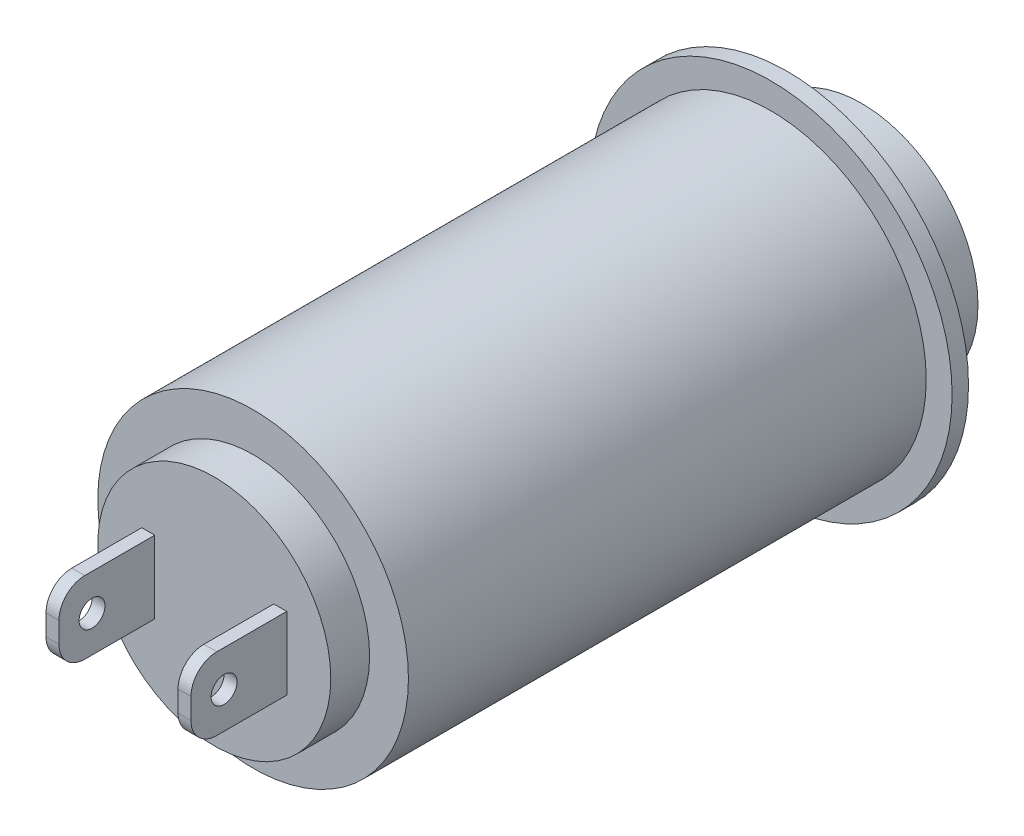
ISO-10303-21;
HEADER;
FILE_DESCRIPTION(('STEP AP214'),'2;1');
FILE_NAME('part.step','',(''),(''),'','','');
FILE_SCHEMA(('AUTOMOTIVE_DESIGN { 1 0 10303 214 1 1 1 1 }'));
ENDSEC;
DATA;
#1=APPLICATION_CONTEXT('core data for automotive mechanical design processes');
#2=APPLICATION_PROTOCOL_DEFINITION('international standard','automotive_design',2000,#1);
#3=PRODUCT_CONTEXT('',#1,'mechanical');
#4=PRODUCT('Part','Part','',(#3));
#5=PRODUCT_RELATED_PRODUCT_CATEGORY('part','',(#4));
#6=PRODUCT_DEFINITION_FORMATION('','',#4);
#7=PRODUCT_DEFINITION_CONTEXT('part definition',#1,'design');
#8=PRODUCT_DEFINITION('design','',#6,#7);
#9=PRODUCT_DEFINITION_SHAPE('','',#8);
#10=(LENGTH_UNIT() NAMED_UNIT(*) SI_UNIT(.MILLI.,.METRE.));
#11=(NAMED_UNIT(*) PLANE_ANGLE_UNIT() SI_UNIT($,.RADIAN.));
#12=(NAMED_UNIT(*) SI_UNIT($,.STERADIAN.) SOLID_ANGLE_UNIT());
#13=UNCERTAINTY_MEASURE_WITH_UNIT(LENGTH_MEASURE(1.E-05),#10,'distance_accuracy_value','');
#14=(GEOMETRIC_REPRESENTATION_CONTEXT(3) GLOBAL_UNCERTAINTY_ASSIGNED_CONTEXT((#13)) GLOBAL_UNIT_ASSIGNED_CONTEXT((#10,
#11,#12)) REPRESENTATION_CONTEXT('',''));
#15=CARTESIAN_POINT('',(0.,0.,0.));
#16=DIRECTION('',(0.,0.,1.));
#17=DIRECTION('',(1.,0.,0.));
#18=AXIS2_PLACEMENT_3D('',#15,#16,#17);
#19=CARTESIAN_POINT('',(0.,0.,25.));
#20=DIRECTION('',(0.,0.,1.));
#21=DIRECTION('',(1.,0.,0.));
#22=AXIS2_PLACEMENT_3D('',#19,#20,#21);
#23=PLANE('',#22);
#24=CARTESIAN_POINT('',(0.,0.,25.));
#25=DIRECTION('',(0.,0.,1.));
#26=DIRECTION('',(1.,0.,0.));
#27=AXIS2_PLACEMENT_3D('',#24,#25,#26);
#28=CIRCLE('',#27,4.5);
#29=CARTESIAN_POINT('',(4.5,0.,25.));
#30=VERTEX_POINT('',#29);
#31=EDGE_CURVE('E204',#30,#30,#28,.T.);
#32=ORIENTED_EDGE('',*,*,#31,.T.);
#33=EDGE_LOOP('',(#32));
#34=FACE_BOUND('',#33,.T.);
#35=DIRECTION('',(-1.,0.,0.));
#36=VECTOR('',#35,1.);
#37=CARTESIAN_POINT('',(-2.8,1.4,25.));
#38=LINE('',#37,#36);
#39=CARTESIAN_POINT('',(-2.3,1.4,25.));
#40=VERTEX_POINT('',#39);
#41=CARTESIAN_POINT('',(-2.8,1.4,25.));
#42=VERTEX_POINT('',#41);
#43=EDGE_CURVE('E182',#40,#42,#38,.T.);
#44=ORIENTED_EDGE('',*,*,#43,.F.);
#45=DIRECTION('',(0.,1.,0.));
#46=VECTOR('',#45,1.);
#47=CARTESIAN_POINT('',(-2.3,-1.4,25.));
#48=LINE('',#47,#46);
#49=CARTESIAN_POINT('',(-2.3,-1.4,25.));
#50=VERTEX_POINT('',#49);
#51=EDGE_CURVE('E136',#50,#40,#48,.T.);
#52=ORIENTED_EDGE('',*,*,#51,.F.);
#53=DIRECTION('',(1.,0.,0.));
#54=VECTOR('',#53,1.);
#55=CARTESIAN_POINT('',(-2.8,-1.4,25.));
#56=LINE('',#55,#54);
#57=CARTESIAN_POINT('',(-2.8,-1.4,25.));
#58=VERTEX_POINT('',#57);
#59=EDGE_CURVE('E174',#58,#50,#56,.T.);
#60=ORIENTED_EDGE('',*,*,#59,.F.);
#61=DIRECTION('',(0.,-1.,0.));
#62=VECTOR('',#61,1.);
#63=CARTESIAN_POINT('',(-2.8,-1.4,25.));
#64=LINE('',#63,#62);
#65=EDGE_CURVE('E186',#42,#58,#64,.T.);
#66=ORIENTED_EDGE('',*,*,#65,.F.);
#67=EDGE_LOOP('',(#44,#52,#60,#66));
#68=FACE_BOUND('',#67,.T.);
#69=DIRECTION('',(-1.,0.,0.));
#70=VECTOR('',#69,1.);
#71=CARTESIAN_POINT('',(2.8,1.4,25.));
#72=LINE('',#71,#70);
#73=CARTESIAN_POINT('',(2.8,1.4,25.));
#74=VERTEX_POINT('',#73);
#75=CARTESIAN_POINT('',(2.3,1.4,25.));
#76=VERTEX_POINT('',#75);
#77=EDGE_CURVE('E132',#74,#76,#72,.T.);
#78=ORIENTED_EDGE('',*,*,#77,.F.);
#79=DIRECTION('',(0.,1.,0.));
#80=VECTOR('',#79,1.);
#81=CARTESIAN_POINT('',(2.8,-1.4,25.));
#82=LINE('',#81,#80);
#83=CARTESIAN_POINT('',(2.8,-1.4,25.));
#84=VERTEX_POINT('',#83);
#85=EDGE_CURVE('E140',#84,#74,#82,.T.);
#86=ORIENTED_EDGE('',*,*,#85,.F.);
#87=DIRECTION('',(1.,0.,0.));
#88=VECTOR('',#87,1.);
#89=CARTESIAN_POINT('',(2.8,-1.4,25.));
#90=LINE('',#89,#88);
#91=CARTESIAN_POINT('',(2.3,-1.4,25.));
#92=VERTEX_POINT('',#91);
#93=EDGE_CURVE('E154',#92,#84,#90,.T.);
#94=ORIENTED_EDGE('',*,*,#93,.F.);
#95=DIRECTION('',(0.,-1.,0.));
#96=VECTOR('',#95,1.);
#97=CARTESIAN_POINT('',(2.3,-1.4,25.));
#98=LINE('',#97,#96);
#99=EDGE_CURVE('E150',#76,#92,#98,.T.);
#100=ORIENTED_EDGE('',*,*,#99,.F.);
#101=EDGE_LOOP('',(#78,#86,#94,#100));
#102=FACE_BOUND('',#101,.T.);
#103=ADVANCED_FACE('F39',(#34,#68,#102),#23,.T.);
#104=CARTESIAN_POINT('',(0.,0.,2.));
#105=DIRECTION('',(0.,0.,-1.));
#106=DIRECTION('',(-1.,0.,0.));
#107=AXIS2_PLACEMENT_3D('',#104,#105,#106);
#108=CYLINDRICAL_SURFACE('',#107,4.5);
#109=CARTESIAN_POINT('',(0.,0.,2.));
#110=DIRECTION('',(0.,0.,1.));
#111=DIRECTION('',(1.,0.,0.));
#112=AXIS2_PLACEMENT_3D('',#109,#110,#111);
#113=CIRCLE('',#112,4.5);
#114=CARTESIAN_POINT('',(4.5,0.,2.));
#115=VERTEX_POINT('',#114);
#116=EDGE_CURVE('E222',#115,#115,#113,.T.);
#117=ORIENTED_EDGE('',*,*,#116,.F.);
#118=EDGE_LOOP('',(#117));
#119=FACE_BOUND('',#118,.T.);
#120=CARTESIAN_POINT('',(0.,0.,0.));
#121=DIRECTION('',(0.,0.,1.));
#122=DIRECTION('',(1.,0.,0.));
#123=AXIS2_PLACEMENT_3D('',#120,#121,#122);
#124=CIRCLE('',#123,4.5);
#125=CARTESIAN_POINT('',(4.5,0.,0.));
#126=VERTEX_POINT('',#125);
#127=EDGE_CURVE('E226',#126,#126,#124,.T.);
#128=ORIENTED_EDGE('',*,*,#127,.T.);
#129=EDGE_LOOP('',(#128));
#130=FACE_BOUND('',#129,.T.);
#131=ADVANCED_FACE('F338',(#119,#130),#108,.T.);
#132=CARTESIAN_POINT('',(0.,0.,0.));
#133=DIRECTION('',(0.,0.,1.));
#134=DIRECTION('',(1.,0.,0.));
#135=AXIS2_PLACEMENT_3D('',#132,#133,#134);
#136=PLANE('',#135);
#137=ORIENTED_EDGE('',*,*,#127,.F.);
#138=EDGE_LOOP('',(#137));
#139=FACE_BOUND('',#138,.T.);
#140=ADVANCED_FACE('F344',(#139),#136,.F.);
#141=CARTESIAN_POINT('',(0.,0.,3.5));
#142=DIRECTION('',(0.,0.,-1.));
#143=DIRECTION('',(-1.,0.,0.));
#144=AXIS2_PLACEMENT_3D('',#141,#142,#143);
#145=CYLINDRICAL_SURFACE('',#144,7.);
#146=CARTESIAN_POINT('',(0.,0.,2.86602540378444));
#147=DIRECTION('',(0.,0.,1.));
#148=DIRECTION('',(1.,0.,0.));
#149=AXIS2_PLACEMENT_3D('',#146,#147,#148);
#150=CIRCLE('',#149,7.);
#151=CARTESIAN_POINT('',(7.,0.,2.86602540378444));
#152=VERTEX_POINT('',#151);
#153=EDGE_CURVE('E213',#152,#152,#150,.T.);
#154=ORIENTED_EDGE('',*,*,#153,.T.);
#155=EDGE_LOOP('',(#154));
#156=FACE_BOUND('',#155,.T.);
#157=CARTESIAN_POINT('',(0.,0.,3.5));
#158=DIRECTION('',(0.,0.,1.));
#159=DIRECTION('',(1.,0.,0.));
#160=AXIS2_PLACEMENT_3D('',#157,#158,#159);
#161=CIRCLE('',#160,7.);
#162=CARTESIAN_POINT('',(7.,0.,3.5));
#163=VERTEX_POINT('',#162);
#164=EDGE_CURVE('E218',#163,#163,#161,.T.);
#165=ORIENTED_EDGE('',*,*,#164,.F.);
#166=EDGE_LOOP('',(#165));
#167=FACE_BOUND('',#166,.T.);
#168=ADVANCED_FACE('F368',(#156,#167),#145,.T.);
#169=CARTESIAN_POINT('',(0.,0.,3.5));
#170=DIRECTION('',(0.,0.,1.));
#171=DIRECTION('',(1.,0.,0.));
#172=AXIS2_PLACEMENT_3D('',#169,#170,#171);
#173=PLANE('',#172);
#174=CARTESIAN_POINT('',(0.,0.,3.5));
#175=DIRECTION('',(0.,0.,1.));
#176=DIRECTION('',(1.,0.,0.));
#177=AXIS2_PLACEMENT_3D('',#174,#175,#176);
#178=CIRCLE('',#177,6.);
#179=CARTESIAN_POINT('',(6.,0.,3.5));
#180=VERTEX_POINT('',#179);
#181=EDGE_CURVE('E214',#180,#180,#178,.T.);
#182=ORIENTED_EDGE('',*,*,#181,.F.);
#183=EDGE_LOOP('',(#182));
#184=FACE_BOUND('',#183,.T.);
#185=ORIENTED_EDGE('',*,*,#164,.T.);
#186=EDGE_LOOP('',(#185));
#187=FACE_BOUND('',#186,.T.);
#188=ADVANCED_FACE('F365',(#184,#187),#173,.T.);
#189=CARTESIAN_POINT('',(0.,0.,2.));
#190=DIRECTION('',(0.,0.,1.));
#191=DIRECTION('',(1.,0.,0.));
#192=AXIS2_PLACEMENT_3D('',#189,#190,#191);
#193=PLANE('',#192);
#194=CARTESIAN_POINT('',(0.,0.,2.));
#195=DIRECTION('',(0.,0.,1.));
#196=DIRECTION('',(1.,0.,0.));
#197=AXIS2_PLACEMENT_3D('',#194,#195,#196);
#198=CIRCLE('',#197,5.49999999999999);
#199=CARTESIAN_POINT('',(5.49999999999999,0.,2.));
#200=VERTEX_POINT('',#199);
#201=EDGE_CURVE('E236',#200,#200,#198,.F.);
#202=ORIENTED_EDGE('',*,*,#201,.T.);
#203=EDGE_LOOP('',(#202));
#204=FACE_BOUND('',#203,.T.);
#205=ORIENTED_EDGE('',*,*,#116,.T.);
#206=EDGE_LOOP('',(#205));
#207=FACE_BOUND('',#206,.T.);
#208=ADVANCED_FACE('F363',(#204,#207),#193,.F.);
#209=CARTESIAN_POINT('',(0.,0.,23.5));
#210=DIRECTION('',(0.,0.,-1.));
#211=DIRECTION('',(-1.,0.,0.));
#212=AXIS2_PLACEMENT_3D('',#209,#210,#211);
#213=CYLINDRICAL_SURFACE('',#212,6.);
#214=CARTESIAN_POINT('',(0.,0.,23.5));
#215=DIRECTION('',(0.,0.,1.));
#216=DIRECTION('',(1.,0.,0.));
#217=AXIS2_PLACEMENT_3D('',#214,#215,#216);
#218=CIRCLE('',#217,6.);
#219=CARTESIAN_POINT('',(6.,0.,23.5));
#220=VERTEX_POINT('',#219);
#221=EDGE_CURVE('E208',#220,#220,#218,.T.);
#222=ORIENTED_EDGE('',*,*,#221,.F.);
#223=EDGE_LOOP('',(#222));
#224=FACE_BOUND('',#223,.T.);
#225=ORIENTED_EDGE('',*,*,#181,.T.);
#226=EDGE_LOOP('',(#225));
#227=FACE_BOUND('',#226,.T.);
#228=ADVANCED_FACE('F359',(#224,#227),#213,.T.);
#229=CARTESIAN_POINT('',(0.,0.,23.5));
#230=DIRECTION('',(0.,0.,1.));
#231=DIRECTION('',(1.,0.,0.));
#232=AXIS2_PLACEMENT_3D('',#229,#230,#231);
#233=PLANE('',#232);
#234=CARTESIAN_POINT('',(0.,0.,23.5));
#235=DIRECTION('',(0.,0.,1.));
#236=DIRECTION('',(1.,0.,0.));
#237=AXIS2_PLACEMENT_3D('',#234,#235,#236);
#238=CIRCLE('',#237,4.5);
#239=CARTESIAN_POINT('',(4.5,0.,23.5));
#240=VERTEX_POINT('',#239);
#241=EDGE_CURVE('E209',#240,#240,#238,.T.);
#242=ORIENTED_EDGE('',*,*,#241,.F.);
#243=EDGE_LOOP('',(#242));
#244=FACE_BOUND('',#243,.T.);
#245=ORIENTED_EDGE('',*,*,#221,.T.);
#246=EDGE_LOOP('',(#245));
#247=FACE_BOUND('',#246,.T.);
#248=ADVANCED_FACE('F355',(#244,#247),#233,.T.);
#249=CARTESIAN_POINT('',(0.,0.,25.));
#250=DIRECTION('',(0.,0.,-1.));
#251=DIRECTION('',(-1.,0.,0.));
#252=AXIS2_PLACEMENT_3D('',#249,#250,#251);
#253=CYLINDRICAL_SURFACE('',#252,4.5);
#254=ORIENTED_EDGE('',*,*,#31,.F.);
#255=EDGE_LOOP('',(#254));
#256=FACE_BOUND('',#255,.T.);
#257=ORIENTED_EDGE('',*,*,#241,.T.);
#258=EDGE_LOOP('',(#257));
#259=FACE_BOUND('',#258,.T.);
#260=ADVANCED_FACE('F352',(#256,#259),#253,.T.);
#261=CARTESIAN_POINT('',(-2.3,-1.4,28.7));
#262=DIRECTION('',(-1.,0.,0.));
#263=DIRECTION('',(0.,0.,1.));
#264=AXIS2_PLACEMENT_3D('',#261,#262,#263);
#265=PLANE('',#264);
#266=CARTESIAN_POINT('',(-2.3,0.,27.4217694937382));
#267=DIRECTION('',(-1.,0.,0.));
#268=DIRECTION('',(0.,0.,1.));
#269=AXIS2_PLACEMENT_3D('',#266,#267,#268);
#270=CIRCLE('',#269,0.499999999999999);
#271=CARTESIAN_POINT('',(-2.3,0.,27.9217694937382));
#272=VERTEX_POINT('',#271);
#273=EDGE_CURVE('E147',#272,#272,#270,.T.);
#274=ORIENTED_EDGE('',*,*,#273,.T.);
#275=EDGE_LOOP('',(#274));
#276=FACE_BOUND('',#275,.T.);
#277=DIRECTION('',(0.,1.,0.));
#278=VECTOR('',#277,1.);
#279=CARTESIAN_POINT('',(-2.3,-1.4,28.7));
#280=LINE('',#279,#278);
#281=CARTESIAN_POINT('',(-2.3,-0.4,28.7));
#282=VERTEX_POINT('',#281);
#283=CARTESIAN_POINT('',(-2.3,0.4,28.7));
#284=VERTEX_POINT('',#283);
#285=EDGE_CURVE('E169',#282,#284,#280,.T.);
#286=ORIENTED_EDGE('',*,*,#285,.F.);
#287=CARTESIAN_POINT('',(-2.3,-0.4,27.7));
#288=DIRECTION('',(-1.,0.,0.));
#289=DIRECTION('',(0.,0.,1.));
#290=AXIS2_PLACEMENT_3D('',#287,#288,#289);
#291=CIRCLE('',#290,1.);
#292=CARTESIAN_POINT('',(-2.3,-1.4,27.7));
#293=VERTEX_POINT('',#292);
#294=EDGE_CURVE('E251',#282,#293,#291,.F.);
#295=ORIENTED_EDGE('',*,*,#294,.T.);
#296=DIRECTION('',(0.,0.,-1.));
#297=VECTOR('',#296,1.);
#298=CARTESIAN_POINT('',(-2.3,-1.4,28.7));
#299=LINE('',#298,#297);
#300=EDGE_CURVE('E178',#293,#50,#299,.T.);
#301=ORIENTED_EDGE('',*,*,#300,.T.);
#302=ORIENTED_EDGE('',*,*,#51,.T.);
#303=DIRECTION('',(0.,0.,-1.));
#304=VECTOR('',#303,1.);
#305=CARTESIAN_POINT('',(-2.3,1.4,28.7));
#306=LINE('',#305,#304);
#307=CARTESIAN_POINT('',(-2.3,1.4,27.7));
#308=VERTEX_POINT('',#307);
#309=EDGE_CURVE('E201',#308,#40,#306,.T.);
#310=ORIENTED_EDGE('',*,*,#309,.F.);
#311=CARTESIAN_POINT('',(-2.3,0.4,27.7));
#312=DIRECTION('',(-1.,0.,0.));
#313=DIRECTION('',(0.,0.,1.));
#314=AXIS2_PLACEMENT_3D('',#311,#312,#313);
#315=CIRCLE('',#314,1.);
#316=EDGE_CURVE('E248',#308,#284,#315,.F.);
#317=ORIENTED_EDGE('',*,*,#316,.T.);
#318=EDGE_LOOP('',(#286,#295,#301,#302,#310,#317));
#319=FACE_BOUND('',#318,.T.);
#320=ADVANCED_FACE('F350',(#276,#319),#265,.F.);
#321=CARTESIAN_POINT('',(-2.8,1.4,28.7));
#322=DIRECTION('',(0.,-1.,0.));
#323=DIRECTION('',(0.,0.,-1.));
#324=AXIS2_PLACEMENT_3D('',#321,#322,#323);
#325=PLANE('',#324);
#326=DIRECTION('',(0.,0.,-1.));
#327=VECTOR('',#326,1.);
#328=CARTESIAN_POINT('',(-2.8,1.4,28.7));
#329=LINE('',#328,#327);
#330=CARTESIAN_POINT('',(-2.8,1.4,27.7));
#331=VERTEX_POINT('',#330);
#332=EDGE_CURVE('E198',#331,#42,#329,.T.);
#333=ORIENTED_EDGE('',*,*,#332,.F.);
#334=DIRECTION('',(-1.,0.,0.));
#335=VECTOR('',#334,1.);
#336=CARTESIAN_POINT('',(-2.8,1.4,27.7));
#337=LINE('',#336,#335);
#338=EDGE_CURVE('E263',#331,#308,#337,.F.);
#339=ORIENTED_EDGE('',*,*,#338,.T.);
#340=ORIENTED_EDGE('',*,*,#309,.T.);
#341=ORIENTED_EDGE('',*,*,#43,.T.);
#342=EDGE_LOOP('',(#333,#339,#340,#341));
#343=FACE_BOUND('',#342,.T.);
#344=ADVANCED_FACE('F416',(#343),#325,.F.);
#345=CARTESIAN_POINT('',(-2.8,-1.4,28.7));
#346=DIRECTION('',(1.,0.,0.));
#347=DIRECTION('',(0.,0.,-1.));
#348=AXIS2_PLACEMENT_3D('',#345,#346,#347);
#349=PLANE('',#348);
#350=CARTESIAN_POINT('',(-2.8,0.,27.4217694937382));
#351=DIRECTION('',(-1.,0.,0.));
#352=DIRECTION('',(0.,0.,1.));
#353=AXIS2_PLACEMENT_3D('',#350,#351,#352);
#354=CIRCLE('',#353,0.499999999999999);
#355=CARTESIAN_POINT('',(-2.8,0.,27.9217694937382));
#356=VERTEX_POINT('',#355);
#357=EDGE_CURVE('E309',#356,#356,#354,.T.);
#358=ORIENTED_EDGE('',*,*,#357,.F.);
#359=EDGE_LOOP('',(#358));
#360=FACE_BOUND('',#359,.T.);
#361=DIRECTION('',(0.,0.,-1.));
#362=VECTOR('',#361,1.);
#363=CARTESIAN_POINT('',(-2.8,-1.4,28.7));
#364=LINE('',#363,#362);
#365=CARTESIAN_POINT('',(-2.8,-1.4,27.7));
#366=VERTEX_POINT('',#365);
#367=EDGE_CURVE('E195',#366,#58,#364,.T.);
#368=ORIENTED_EDGE('',*,*,#367,.F.);
#369=CARTESIAN_POINT('',(-2.8,-0.4,27.7));
#370=DIRECTION('',(1.,0.,0.));
#371=DIRECTION('',(0.,0.,-1.));
#372=AXIS2_PLACEMENT_3D('',#369,#370,#371);
#373=CIRCLE('',#372,1.);
#374=CARTESIAN_POINT('',(-2.8,-0.4,28.7));
#375=VERTEX_POINT('',#374);
#376=EDGE_CURVE('E260',#366,#375,#373,.F.);
#377=ORIENTED_EDGE('',*,*,#376,.T.);
#378=DIRECTION('',(0.,-1.,0.));
#379=VECTOR('',#378,1.);
#380=CARTESIAN_POINT('',(-2.8,-1.4,28.7));
#381=LINE('',#380,#379);
#382=CARTESIAN_POINT('',(-2.8,0.4,28.7));
#383=VERTEX_POINT('',#382);
#384=EDGE_CURVE('E173',#383,#375,#381,.T.);
#385=ORIENTED_EDGE('',*,*,#384,.F.);
#386=CARTESIAN_POINT('',(-2.8,0.4,27.7));
#387=DIRECTION('',(1.,0.,0.));
#388=DIRECTION('',(0.,0.,-1.));
#389=AXIS2_PLACEMENT_3D('',#386,#387,#388);
#390=CIRCLE('',#389,1.);
#391=EDGE_CURVE('E257',#383,#331,#390,.F.);
#392=ORIENTED_EDGE('',*,*,#391,.T.);
#393=ORIENTED_EDGE('',*,*,#332,.T.);
#394=ORIENTED_EDGE('',*,*,#65,.T.);
#395=EDGE_LOOP('',(#368,#377,#385,#392,#393,#394));
#396=FACE_BOUND('',#395,.T.);
#397=ADVANCED_FACE('F428',(#360,#396),#349,.F.);
#398=CARTESIAN_POINT('',(-2.8,-1.4,28.7));
#399=DIRECTION('',(0.,1.,0.));
#400=DIRECTION('',(0.,0.,1.));
#401=AXIS2_PLACEMENT_3D('',#398,#399,#400);
#402=PLANE('',#401);
#403=ORIENTED_EDGE('',*,*,#300,.F.);
#404=DIRECTION('',(1.,0.,0.));
#405=VECTOR('',#404,1.);
#406=CARTESIAN_POINT('',(-2.8,-1.4,27.7));
#407=LINE('',#406,#405);
#408=EDGE_CURVE('E254',#293,#366,#407,.F.);
#409=ORIENTED_EDGE('',*,*,#408,.T.);
#410=ORIENTED_EDGE('',*,*,#367,.T.);
#411=ORIENTED_EDGE('',*,*,#59,.T.);
#412=EDGE_LOOP('',(#403,#409,#410,#411));
#413=FACE_BOUND('',#412,.T.);
#414=ADVANCED_FACE('F334',(#413),#402,.F.);
#415=CARTESIAN_POINT('',(0.,0.,28.7));
#416=DIRECTION('',(0.,0.,-1.));
#417=DIRECTION('',(-1.,0.,0.));
#418=AXIS2_PLACEMENT_3D('',#415,#416,#417);
#419=PLANE('',#418);
#420=ORIENTED_EDGE('',*,*,#384,.T.);
#421=DIRECTION('',(1.,0.,0.));
#422=VECTOR('',#421,1.);
#423=CARTESIAN_POINT('',(0.,-0.4,28.7));
#424=LINE('',#423,#422);
#425=EDGE_CURVE('E244',#375,#282,#424,.T.);
#426=ORIENTED_EDGE('',*,*,#425,.T.);
#427=ORIENTED_EDGE('',*,*,#285,.T.);
#428=DIRECTION('',(-1.,0.,0.));
#429=VECTOR('',#428,1.);
#430=CARTESIAN_POINT('',(0.,0.4,28.7));
#431=LINE('',#430,#429);
#432=EDGE_CURVE('E240',#284,#383,#431,.T.);
#433=ORIENTED_EDGE('',*,*,#432,.T.);
#434=EDGE_LOOP('',(#420,#426,#427,#433));
#435=FACE_BOUND('',#434,.T.);
#436=ADVANCED_FACE('F327',(#435),#419,.F.);
#437=CARTESIAN_POINT('',(2.8,-1.4,28.7));
#438=DIRECTION('',(-1.,0.,0.));
#439=DIRECTION('',(0.,0.,1.));
#440=AXIS2_PLACEMENT_3D('',#437,#438,#439);
#441=PLANE('',#440);
#442=CARTESIAN_POINT('',(2.8,0.,27.4217694937382));
#443=DIRECTION('',(-1.,0.,0.));
#444=DIRECTION('',(0.,0.,1.));
#445=AXIS2_PLACEMENT_3D('',#442,#443,#444);
#446=CIRCLE('',#445,0.499999999999999);
#447=CARTESIAN_POINT('',(2.8,0.,27.9217694937382));
#448=VERTEX_POINT('',#447);
#449=EDGE_CURVE('E305',#448,#448,#446,.T.);
#450=ORIENTED_EDGE('',*,*,#449,.T.);
#451=EDGE_LOOP('',(#450));
#452=FACE_BOUND('',#451,.T.);
#453=DIRECTION('',(0.,0.,-1.));
#454=VECTOR('',#453,1.);
#455=CARTESIAN_POINT('',(2.8,1.4,28.7));
#456=LINE('',#455,#454);
#457=CARTESIAN_POINT('',(2.8,1.4,27.7));
#458=VERTEX_POINT('',#457);
#459=EDGE_CURVE('E128',#458,#74,#456,.T.);
#460=ORIENTED_EDGE('',*,*,#459,.F.);
#461=CARTESIAN_POINT('',(2.8,0.4,27.7));
#462=DIRECTION('',(-1.,0.,0.));
#463=DIRECTION('',(0.,0.,1.));
#464=AXIS2_PLACEMENT_3D('',#461,#462,#463);
#465=CIRCLE('',#464,1.);
#466=CARTESIAN_POINT('',(2.8,0.4,28.7));
#467=VERTEX_POINT('',#466);
#468=EDGE_CURVE('E49',#458,#467,#465,.F.);
#469=ORIENTED_EDGE('',*,*,#468,.T.);
#470=DIRECTION('',(0.,1.,0.));
#471=VECTOR('',#470,1.);
#472=CARTESIAN_POINT('',(2.8,-1.4,28.7));
#473=LINE('',#472,#471);
#474=CARTESIAN_POINT('',(2.8,-0.4,28.7));
#475=VERTEX_POINT('',#474);
#476=EDGE_CURVE('E160',#475,#467,#473,.T.);
#477=ORIENTED_EDGE('',*,*,#476,.F.);
#478=CARTESIAN_POINT('',(2.8,-0.4,27.7));
#479=DIRECTION('',(-1.,0.,0.));
#480=DIRECTION('',(0.,0.,1.));
#481=AXIS2_PLACEMENT_3D('',#478,#479,#480);
#482=CIRCLE('',#481,1.);
#483=CARTESIAN_POINT('',(2.8,-1.4,27.7));
#484=VERTEX_POINT('',#483);
#485=EDGE_CURVE('E56',#475,#484,#482,.F.);
#486=ORIENTED_EDGE('',*,*,#485,.T.);
#487=DIRECTION('',(0.,0.,-1.));
#488=VECTOR('',#487,1.);
#489=CARTESIAN_POINT('',(2.8,-1.4,28.7));
#490=LINE('',#489,#488);
#491=EDGE_CURVE('E142',#484,#84,#490,.T.);
#492=ORIENTED_EDGE('',*,*,#491,.T.);
#493=ORIENTED_EDGE('',*,*,#85,.T.);
#494=EDGE_LOOP('',(#460,#469,#477,#486,#492,#493));
#495=FACE_BOUND('',#494,.T.);
#496=ADVANCED_FACE('F141',(#452,#495),#441,.F.);
#497=CARTESIAN_POINT('',(2.8,1.4,28.7));
#498=DIRECTION('',(0.,-1.,0.));
#499=DIRECTION('',(0.,0.,-1.));
#500=AXIS2_PLACEMENT_3D('',#497,#498,#499);
#501=PLANE('',#500);
#502=DIRECTION('',(0.,0.,-1.));
#503=VECTOR('',#502,1.);
#504=CARTESIAN_POINT('',(2.3,1.4,28.7));
#505=LINE('',#504,#503);
#506=CARTESIAN_POINT('',(2.3,1.4,27.7));
#507=VERTEX_POINT('',#506);
#508=EDGE_CURVE('E137',#507,#76,#505,.T.);
#509=ORIENTED_EDGE('',*,*,#508,.F.);
#510=DIRECTION('',(-1.,0.,0.));
#511=VECTOR('',#510,1.);
#512=CARTESIAN_POINT('',(2.8,1.4,27.7));
#513=LINE('',#512,#511);
#514=EDGE_CURVE('E64',#507,#458,#513,.F.);
#515=ORIENTED_EDGE('',*,*,#514,.T.);
#516=ORIENTED_EDGE('',*,*,#459,.T.);
#517=ORIENTED_EDGE('',*,*,#77,.T.);
#518=EDGE_LOOP('',(#509,#515,#516,#517));
#519=FACE_BOUND('',#518,.T.);
#520=ADVANCED_FACE('F130',(#519),#501,.F.);
#521=CARTESIAN_POINT('',(2.3,-1.4,28.7));
#522=DIRECTION('',(1.,0.,0.));
#523=DIRECTION('',(0.,0.,-1.));
#524=AXIS2_PLACEMENT_3D('',#521,#522,#523);
#525=PLANE('',#524);
#526=CARTESIAN_POINT('',(2.3,0.,27.4217694937382));
#527=DIRECTION('',(1.,0.,0.));
#528=DIRECTION('',(0.,0.,-1.));
#529=AXIS2_PLACEMENT_3D('',#526,#527,#528);
#530=CIRCLE('',#529,0.499999999999999);
#531=CARTESIAN_POINT('',(2.3,0.,26.9217694937382));
#532=VERTEX_POINT('',#531);
#533=EDGE_CURVE('E43',#532,#532,#530,.T.);
#534=ORIENTED_EDGE('',*,*,#533,.T.);
#535=EDGE_LOOP('',(#534));
#536=FACE_BOUND('',#535,.T.);
#537=DIRECTION('',(0.,-1.,0.));
#538=VECTOR('',#537,1.);
#539=CARTESIAN_POINT('',(2.3,-1.4,28.7));
#540=LINE('',#539,#538);
#541=CARTESIAN_POINT('',(2.3,0.4,28.7));
#542=VERTEX_POINT('',#541);
#543=CARTESIAN_POINT('',(2.3,-0.4,28.7));
#544=VERTEX_POINT('',#543);
#545=EDGE_CURVE('E164',#542,#544,#540,.T.);
#546=ORIENTED_EDGE('',*,*,#545,.F.);
#547=CARTESIAN_POINT('',(2.3,0.4,27.7));
#548=DIRECTION('',(1.,0.,0.));
#549=DIRECTION('',(0.,0.,-1.));
#550=AXIS2_PLACEMENT_3D('',#547,#548,#549);
#551=CIRCLE('',#550,1.);
#552=EDGE_CURVE('E277',#542,#507,#551,.F.);
#553=ORIENTED_EDGE('',*,*,#552,.T.);
#554=ORIENTED_EDGE('',*,*,#508,.T.);
#555=ORIENTED_EDGE('',*,*,#99,.T.);
#556=DIRECTION('',(0.,0.,-1.));
#557=VECTOR('',#556,1.);
#558=CARTESIAN_POINT('',(2.3,-1.4,28.7));
#559=LINE('',#558,#557);
#560=CARTESIAN_POINT('',(2.3,-1.4,27.7));
#561=VERTEX_POINT('',#560);
#562=EDGE_CURVE('E163',#561,#92,#559,.T.);
#563=ORIENTED_EDGE('',*,*,#562,.F.);
#564=CARTESIAN_POINT('',(2.3,-0.4,27.7));
#565=DIRECTION('',(1.,0.,0.));
#566=DIRECTION('',(0.,0.,-1.));
#567=AXIS2_PLACEMENT_3D('',#564,#565,#566);
#568=CIRCLE('',#567,1.);
#569=EDGE_CURVE('E274',#561,#544,#568,.F.);
#570=ORIENTED_EDGE('',*,*,#569,.T.);
#571=EDGE_LOOP('',(#546,#553,#554,#555,#563,#570));
#572=FACE_BOUND('',#571,.T.);
#573=ADVANCED_FACE('F297',(#536,#572),#525,.F.);
#574=CARTESIAN_POINT('',(2.8,-1.4,28.7));
#575=DIRECTION('',(0.,1.,0.));
#576=DIRECTION('',(0.,0.,1.));
#577=AXIS2_PLACEMENT_3D('',#574,#575,#576);
#578=PLANE('',#577);
#579=ORIENTED_EDGE('',*,*,#491,.F.);
#580=DIRECTION('',(1.,0.,0.));
#581=VECTOR('',#580,1.);
#582=CARTESIAN_POINT('',(2.3,-1.4,27.7));
#583=LINE('',#582,#581);
#584=EDGE_CURVE('E11',#484,#561,#583,.F.);
#585=ORIENTED_EDGE('',*,*,#584,.T.);
#586=ORIENTED_EDGE('',*,*,#562,.T.);
#587=ORIENTED_EDGE('',*,*,#93,.T.);
#588=EDGE_LOOP('',(#579,#585,#586,#587));
#589=FACE_BOUND('',#588,.T.);
#590=ADVANCED_FACE('F399',(#589),#578,.F.);
#591=CARTESIAN_POINT('',(0.,0.,28.7));
#592=DIRECTION('',(0.,0.,1.));
#593=DIRECTION('',(1.,0.,0.));
#594=AXIS2_PLACEMENT_3D('',#591,#592,#593);
#595=PLANE('',#594);
#596=ORIENTED_EDGE('',*,*,#476,.T.);
#597=DIRECTION('',(-1.,0.,0.));
#598=VECTOR('',#597,1.);
#599=CARTESIAN_POINT('',(2.3,0.4,28.7));
#600=LINE('',#599,#598);
#601=EDGE_CURVE('E270',#467,#542,#600,.T.);
#602=ORIENTED_EDGE('',*,*,#601,.T.);
#603=ORIENTED_EDGE('',*,*,#545,.T.);
#604=DIRECTION('',(1.,0.,0.));
#605=VECTOR('',#604,1.);
#606=CARTESIAN_POINT('',(2.8,-0.4,28.7));
#607=LINE('',#606,#605);
#608=EDGE_CURVE('E266',#544,#475,#607,.T.);
#609=ORIENTED_EDGE('',*,*,#608,.T.);
#610=EDGE_LOOP('',(#596,#602,#603,#609));
#611=FACE_BOUND('',#610,.T.);
#612=ADVANCED_FACE('F289',(#611),#595,.T.);
#613=CARTESIAN_POINT('',(0.,0.,2.86602540378444));
#614=DIRECTION('',(0.,0.,1.));
#615=DIRECTION('',(1.,0.,0.));
#616=AXIS2_PLACEMENT_3D('',#613,#614,#615);
#617=CONICAL_SURFACE('',#616,7.,1.0471975511966);
#618=CARTESIAN_POINT('',(5.49999999999999,0.,2.));
#619=CARTESIAN_POINT('',(5.51562499999999,0.,2.00902109795609));
#620=CARTESIAN_POINT('',(5.53124999999999,0.,2.01804219591218));
#621=CARTESIAN_POINT('',(5.56249999999999,0.,2.03608439182435));
#622=CARTESIAN_POINT('',(5.57812499999999,0.,2.04510548978044));
#623=CARTESIAN_POINT('',(5.60937499999999,0.,2.06314768569261));
#624=CARTESIAN_POINT('',(5.62499999999999,0.,2.0721687836487));
#625=CARTESIAN_POINT('',(5.65624999999999,0.,2.09021097956088));
#626=CARTESIAN_POINT('',(5.67187499999999,0.,2.09923207751697));
#627=CARTESIAN_POINT('',(5.70312499999999,0.,2.11727427342914));
#628=CARTESIAN_POINT('',(5.71874999999999,0.,2.12629537138523));
#629=CARTESIAN_POINT('',(5.74999999999999,0.,2.14433756729741));
#630=CARTESIAN_POINT('',(5.76562499999999,0.,2.15335866525349));
#631=CARTESIAN_POINT('',(5.79687499999999,0.,2.17140086116567));
#632=CARTESIAN_POINT('',(5.81249999999999,0.,2.18042195912176));
#633=CARTESIAN_POINT('',(5.84374999999999,0.,2.19846415503393));
#634=CARTESIAN_POINT('',(5.85937499999999,0.,2.20748525299002));
#635=CARTESIAN_POINT('',(5.89062499999999,0.,2.2255274489022));
#636=CARTESIAN_POINT('',(5.90624999999999,0.,2.23454854685829));
#637=CARTESIAN_POINT('',(5.93749999999999,0.,2.25259074277046));
#638=CARTESIAN_POINT('',(5.95312499999999,0.,2.26161184072655));
#639=CARTESIAN_POINT('',(5.98437499999999,0.,2.27965403663873));
#640=CARTESIAN_POINT('',(5.99999999999999,0.,2.28867513459481));
#641=CARTESIAN_POINT('',(6.03124999999999,0.,2.30671733050699));
#642=CARTESIAN_POINT('',(6.04687499999999,0.,2.31573842846308));
#643=CARTESIAN_POINT('',(6.07812499999999,0.,2.33378062437525));
#644=CARTESIAN_POINT('',(6.09374999999999,0.,2.34280172233134));
#645=CARTESIAN_POINT('',(6.12499999999999,0.,2.36084391824352));
#646=CARTESIAN_POINT('',(6.14062499999999,0.,2.3698650161996));
#647=CARTESIAN_POINT('',(6.17187499999999,0.,2.38790721211178));
#648=CARTESIAN_POINT('',(6.18749999999999,0.,2.39692831006787));
#649=CARTESIAN_POINT('',(6.21874999999999,0.,2.41497050598004));
#650=CARTESIAN_POINT('',(6.23437499999999,0.,2.42399160393613));
#651=CARTESIAN_POINT('',(6.26562499999999,0.,2.44203379984831));
#652=CARTESIAN_POINT('',(6.28124999999999,0.,2.4510548978044));
#653=CARTESIAN_POINT('',(6.31249999999999,0.,2.46909709371657));
#654=CARTESIAN_POINT('',(6.32812499999999,0.,2.47811819167266));
#655=CARTESIAN_POINT('',(6.35937499999999,0.,2.49616038758484));
#656=CARTESIAN_POINT('',(6.37499999999999,0.,2.50518148554092));
#657=CARTESIAN_POINT('',(6.40624999999999,0.,2.5232236814531));
#658=CARTESIAN_POINT('',(6.421875,0.,2.53224477940919));
#659=CARTESIAN_POINT('',(6.453125,0.,2.55028697532136));
#660=CARTESIAN_POINT('',(6.46875,0.,2.55930807327745));
#661=CARTESIAN_POINT('',(6.5,0.,2.57735026918963));
#662=CARTESIAN_POINT('',(6.515625,0.,2.58637136714571));
#663=CARTESIAN_POINT('',(6.546875,0.,2.60441356305789));
#664=CARTESIAN_POINT('',(6.5625,0.,2.61343466101398));
#665=CARTESIAN_POINT('',(6.59375,0.,2.63147685692615));
#666=CARTESIAN_POINT('',(6.609375,0.,2.64049795488224));
#667=CARTESIAN_POINT('',(6.640625,0.,2.65854015079442));
#668=CARTESIAN_POINT('',(6.65625,0.,2.66756124875051));
#669=CARTESIAN_POINT('',(6.6875,0.,2.68560344466268));
#670=CARTESIAN_POINT('',(6.703125,0.,2.69462454261877));
#671=CARTESIAN_POINT('',(6.734375,0.,2.71266673853095));
#672=CARTESIAN_POINT('',(6.75,0.,2.72168783648703));
#673=CARTESIAN_POINT('',(6.78125,0.,2.73973003239921));
#674=CARTESIAN_POINT('',(6.796875,0.,2.7487511303553));
#675=CARTESIAN_POINT('',(6.828125,0.,2.76679332626747));
#676=CARTESIAN_POINT('',(6.84375,0.,2.77581442422356));
#677=CARTESIAN_POINT('',(6.875,0.,2.79385662013574));
#678=CARTESIAN_POINT('',(6.890625,0.,2.80287771809182));
#679=CARTESIAN_POINT('',(6.921875,0.,2.820919914004));
#680=CARTESIAN_POINT('',(6.9375,0.,2.82994101196009));
#681=CARTESIAN_POINT('',(6.96875,0.,2.84798320787226));
#682=CARTESIAN_POINT('',(6.984375,0.,2.85700430582835));
#683=CARTESIAN_POINT('',(7.,0.,2.86602540378444));
#684=B_SPLINE_CURVE_WITH_KNOTS('',3,(#618,#619,#620,#621,#622,#623,#624,#625,#626,#627,#628,
#629,#630,#631,#632,#633,#634,#635,#636,#637,#638,#639,#640,#641,#642,#643,#644,#645,#646,#647,
#648,#649,#650,#651,#652,#653,#654,#655,#656,#657,#658,#659,#660,#661,#662,#663,#664,#665,#666,
#667,#668,#669,#670,#671,#672,#673,#674,#675,#676,#677,#678,#679,#680,#681,#682,#683),
.UNSPECIFIED.,.F.,.F.,(4,2,2,2,2,2,2,2,2,2,2,2,2,2,2,2,2,2,2,2,2,2,2,2,2,2,2,2,2,2,2,2,4),(0.,
0.0541265877365283,0.108253175473056,0.162379763209583,0.216506350946111,0.270632938682639,
0.324759526419167,0.378886114155695,0.433012701892222,0.48713928962875,0.541265877365278,
0.595392465101806,0.649519052838333,0.703645640574862,0.757772228311389,0.811898816047916,
0.866025403784445,0.920151991520972,0.9742785792575,1.02840516699403,1.08253175473056,
1.13665834246708,1.19078493020361,1.24491151794014,1.29903810567667,1.3531646934132,
1.40729128114972,1.46141786888625,1.51554445662278,1.56967104435931,1.62379763209583,
1.67792421983236,1.73205080756889),.UNSPECIFIED.);
#685=EDGE_CURVE('BSEAM379',#200,#152,#684,.T.);
#686=ORIENTED_EDGE('',*,*,#201,.F.);
#687=ORIENTED_EDGE('',*,*,#153,.F.);
#688=ORIENTED_EDGE('',*,*,#685,.T.);
#689=ORIENTED_EDGE('',*,*,#685,.F.);
#690=EDGE_LOOP('',(#686,#688,#687,#689));
#691=FACE_BOUND('',#690,.T.);
#692=ADVANCED_FACE('F379',(#691),#617,.T.);
#693=CARTESIAN_POINT('',(0.,-0.4,27.7));
#694=DIRECTION('',(1.,0.,0.));
#695=DIRECTION('',(0.,0.,-1.));
#696=AXIS2_PLACEMENT_3D('',#693,#694,#695);
#697=CYLINDRICAL_SURFACE('',#696,1.);
#698=ORIENTED_EDGE('',*,*,#376,.F.);
#699=ORIENTED_EDGE('',*,*,#408,.F.);
#700=ORIENTED_EDGE('',*,*,#294,.F.);
#701=ORIENTED_EDGE('',*,*,#425,.F.);
#702=EDGE_LOOP('',(#698,#699,#700,#701));
#703=FACE_BOUND('',#702,.T.);
#704=ADVANCED_FACE('F382',(#703),#697,.T.);
#705=CARTESIAN_POINT('',(0.,0.4,27.7));
#706=DIRECTION('',(-1.,0.,0.));
#707=DIRECTION('',(0.,0.,1.));
#708=AXIS2_PLACEMENT_3D('',#705,#706,#707);
#709=CYLINDRICAL_SURFACE('',#708,1.);
#710=ORIENTED_EDGE('',*,*,#316,.F.);
#711=ORIENTED_EDGE('',*,*,#338,.F.);
#712=ORIENTED_EDGE('',*,*,#391,.F.);
#713=ORIENTED_EDGE('',*,*,#432,.F.);
#714=EDGE_LOOP('',(#710,#711,#712,#713));
#715=FACE_BOUND('',#714,.T.);
#716=ADVANCED_FACE('F386',(#715),#709,.T.);
#717=CARTESIAN_POINT('',(0.,0.4,27.7));
#718=DIRECTION('',(1.,0.,0.));
#719=DIRECTION('',(0.,0.,-1.));
#720=AXIS2_PLACEMENT_3D('',#717,#718,#719);
#721=CYLINDRICAL_SURFACE('',#720,1.);
#722=ORIENTED_EDGE('',*,*,#468,.F.);
#723=ORIENTED_EDGE('',*,*,#514,.F.);
#724=ORIENTED_EDGE('',*,*,#552,.F.);
#725=ORIENTED_EDGE('',*,*,#601,.F.);
#726=EDGE_LOOP('',(#722,#723,#724,#725));
#727=FACE_BOUND('',#726,.T.);
#728=ADVANCED_FACE('F295',(#727),#721,.T.);
#729=CARTESIAN_POINT('',(0.,-0.4,27.7));
#730=DIRECTION('',(-1.,0.,0.));
#731=DIRECTION('',(0.,0.,1.));
#732=AXIS2_PLACEMENT_3D('',#729,#730,#731);
#733=CYLINDRICAL_SURFACE('',#732,1.);
#734=ORIENTED_EDGE('',*,*,#569,.F.);
#735=ORIENTED_EDGE('',*,*,#584,.F.);
#736=ORIENTED_EDGE('',*,*,#485,.F.);
#737=ORIENTED_EDGE('',*,*,#608,.F.);
#738=EDGE_LOOP('',(#734,#735,#736,#737));
#739=FACE_BOUND('',#738,.T.);
#740=ADVANCED_FACE('F41',(#739),#733,.T.);
#741=CARTESIAN_POINT('',(7.,0.,27.4217694937382));
#742=DIRECTION('',(-1.,0.,0.));
#743=DIRECTION('',(0.,0.,1.));
#744=AXIS2_PLACEMENT_3D('',#741,#742,#743);
#745=CYLINDRICAL_SURFACE('',#744,0.499999999999999);
#746=ORIENTED_EDGE('',*,*,#533,.F.);
#747=EDGE_LOOP('',(#746));
#748=FACE_BOUND('',#747,.T.);
#749=ORIENTED_EDGE('',*,*,#449,.F.);
#750=EDGE_LOOP('',(#749));
#751=FACE_BOUND('',#750,.T.);
#752=ADVANCED_FACE('F319',(#748,#751),#745,.F.);
#753=ORIENTED_EDGE('',*,*,#357,.T.);
#754=EDGE_LOOP('',(#753));
#755=FACE_BOUND('',#754,.T.);
#756=ORIENTED_EDGE('',*,*,#273,.F.);
#757=EDGE_LOOP('',(#756));
#758=FACE_BOUND('',#757,.T.);
#759=ADVANCED_FACE('F322',(#755,#758),#745,.F.);
#760=CLOSED_SHELL('',(#103,#131,#140,#168,#188,#208,#228,#248,#260,#320,#344,#397,#414,#436,
#496,#520,#573,#590,#612,#692,#704,#716,#728,#740,#752,#759));
#761=MANIFOLD_SOLID_BREP('B2',#760);
#762=ADVANCED_BREP_SHAPE_REPRESENTATION('',(#18,#761),#14);
#763=SHAPE_DEFINITION_REPRESENTATION(#9,#762);
ENDSEC;
END-ISO-10303-21;
